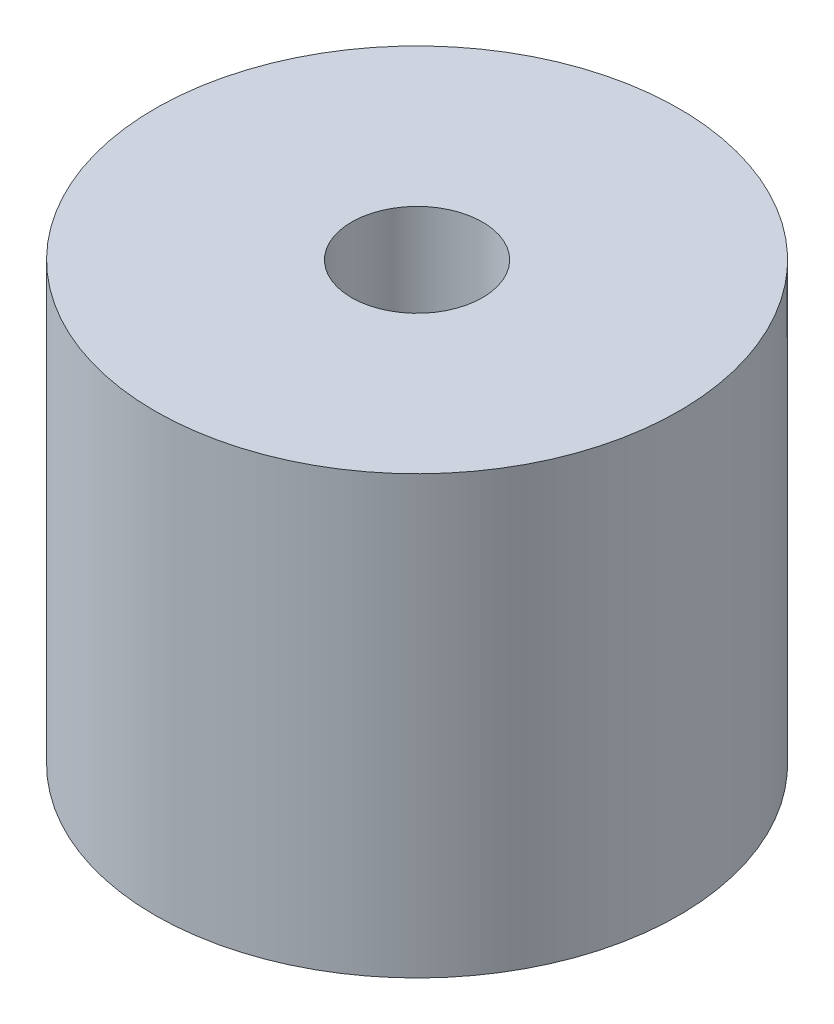
ISO-10303-21;
HEADER;
FILE_DESCRIPTION(('STEP AP214'),'2;1');
FILE_NAME('part.step','',(''),(''),'','','');
FILE_SCHEMA(('AUTOMOTIVE_DESIGN { 1 0 10303 214 1 1 1 1 }'));
ENDSEC;
DATA;
#1=APPLICATION_CONTEXT('core data for automotive mechanical design processes');
#2=APPLICATION_PROTOCOL_DEFINITION('international standard','automotive_design',2000,#1);
#3=PRODUCT_CONTEXT('',#1,'mechanical');
#4=PRODUCT('Part','Part','',(#3));
#5=PRODUCT_RELATED_PRODUCT_CATEGORY('part','',(#4));
#6=PRODUCT_DEFINITION_FORMATION('','',#4);
#7=PRODUCT_DEFINITION_CONTEXT('part definition',#1,'design');
#8=PRODUCT_DEFINITION('design','',#6,#7);
#9=PRODUCT_DEFINITION_SHAPE('','',#8);
#10=(LENGTH_UNIT() NAMED_UNIT(*) SI_UNIT(.MILLI.,.METRE.));
#11=(NAMED_UNIT(*) PLANE_ANGLE_UNIT() SI_UNIT($,.RADIAN.));
#12=(NAMED_UNIT(*) SI_UNIT($,.STERADIAN.) SOLID_ANGLE_UNIT());
#13=UNCERTAINTY_MEASURE_WITH_UNIT(LENGTH_MEASURE(1.E-05),#10,'distance_accuracy_value','');
#14=(GEOMETRIC_REPRESENTATION_CONTEXT(3) GLOBAL_UNCERTAINTY_ASSIGNED_CONTEXT((#13)) GLOBAL_UNIT_ASSIGNED_CONTEXT((#10,
#11,#12)) REPRESENTATION_CONTEXT('',''));
#15=CARTESIAN_POINT('',(0.,0.,0.));
#16=DIRECTION('',(0.,0.,1.));
#17=DIRECTION('',(1.,0.,0.));
#18=AXIS2_PLACEMENT_3D('',#15,#16,#17);
#19=CARTESIAN_POINT('',(0.,0.,0.));
#20=DIRECTION('',(0.,1.,0.));
#21=DIRECTION('',(0.,0.,1.));
#22=AXIS2_PLACEMENT_3D('',#19,#20,#21);
#23=PLANE('',#22);
#24=DIRECTION('',(0.,0.,-1.));
#25=VECTOR('',#24,1.);
#26=CARTESIAN_POINT('',(3.05,0.,2.73998175176405));
#27=LINE('',#26,#25);
#28=CARTESIAN_POINT('',(3.05,0.,2.73998175176405));
#29=VERTEX_POINT('',#28);
#30=CARTESIAN_POINT('',(3.05,0.,-2.73998175176405));
#31=VERTEX_POINT('',#30);
#32=EDGE_CURVE('E77',#29,#31,#27,.T.);
#33=ORIENTED_EDGE('',*,*,#32,.T.);
#34=CARTESIAN_POINT('',(0.,0.,0.));
#35=DIRECTION('',(0.,-1.,0.));
#36=DIRECTION('',(0.,0.,-1.));
#37=AXIS2_PLACEMENT_3D('',#34,#35,#36);
#38=CIRCLE('',#37,4.1);
#39=EDGE_CURVE('E58',#29,#31,#38,.T.);
#40=ORIENTED_EDGE('',*,*,#39,.F.);
#41=EDGE_LOOP('',(#33,#40));
#42=FACE_BOUND('',#41,.T.);
#43=CARTESIAN_POINT('',(0.,0.,0.));
#44=DIRECTION('',(0.,1.,0.));
#45=DIRECTION('',(0.,0.,1.));
#46=AXIS2_PLACEMENT_3D('',#43,#44,#45);
#47=CIRCLE('',#46,12.);
#48=CARTESIAN_POINT('',(0.,0.,12.));
#49=VERTEX_POINT('',#48);
#50=EDGE_CURVE('E50',#49,#49,#47,.T.);
#51=ORIENTED_EDGE('',*,*,#50,.F.);
#52=EDGE_LOOP('',(#51));
#53=FACE_BOUND('',#52,.T.);
#54=ADVANCED_FACE('F41',(#42,#53),#23,.F.);
#55=CARTESIAN_POINT('',(0.,20.,0.));
#56=DIRECTION('',(0.,-1.,0.));
#57=DIRECTION('',(0.,0.,-1.));
#58=AXIS2_PLACEMENT_3D('',#55,#56,#57);
#59=CYLINDRICAL_SURFACE('',#58,12.);
#60=CARTESIAN_POINT('',(0.,20.,0.));
#61=DIRECTION('',(0.,1.,0.));
#62=DIRECTION('',(0.,0.,1.));
#63=AXIS2_PLACEMENT_3D('',#60,#61,#62);
#64=CIRCLE('',#63,12.);
#65=CARTESIAN_POINT('',(0.,20.,12.));
#66=VERTEX_POINT('',#65);
#67=EDGE_CURVE('E12',#66,#66,#64,.T.);
#68=ORIENTED_EDGE('',*,*,#67,.F.);
#69=EDGE_LOOP('',(#68));
#70=FACE_BOUND('',#69,.T.);
#71=ORIENTED_EDGE('',*,*,#50,.T.);
#72=EDGE_LOOP('',(#71));
#73=FACE_BOUND('',#72,.T.);
#74=ADVANCED_FACE('F43',(#70,#73),#59,.T.);
#75=CARTESIAN_POINT('',(0.,20.,0.));
#76=DIRECTION('',(0.,1.,0.));
#77=DIRECTION('',(0.,0.,1.));
#78=AXIS2_PLACEMENT_3D('',#75,#76,#77);
#79=PLANE('',#78);
#80=CARTESIAN_POINT('',(0.,20.,0.));
#81=DIRECTION('',(0.,1.,0.));
#82=DIRECTION('',(0.,0.,1.));
#83=AXIS2_PLACEMENT_3D('',#80,#81,#82);
#84=CIRCLE('',#83,3.);
#85=CARTESIAN_POINT('',(0.,20.,3.));
#86=VERTEX_POINT('',#85);
#87=EDGE_CURVE('E84',#86,#86,#84,.T.);
#88=ORIENTED_EDGE('',*,*,#87,.F.);
#89=EDGE_LOOP('',(#88));
#90=FACE_BOUND('',#89,.T.);
#91=ORIENTED_EDGE('',*,*,#67,.T.);
#92=EDGE_LOOP('',(#91));
#93=FACE_BOUND('',#92,.T.);
#94=ADVANCED_FACE('F93',(#90,#93),#79,.T.);
#95=CARTESIAN_POINT('',(0.,13.,0.));
#96=DIRECTION('',(0.,-1.,0.));
#97=DIRECTION('',(0.,0.,-1.));
#98=AXIS2_PLACEMENT_3D('',#95,#96,#97);
#99=CYLINDRICAL_SURFACE('',#98,4.1);
#100=ORIENTED_EDGE('',*,*,#39,.T.);
#101=DIRECTION('',(0.,-1.,0.));
#102=VECTOR('',#101,1.);
#103=CARTESIAN_POINT('',(3.05,13.,-2.73998175176405));
#104=LINE('',#103,#102);
#105=CARTESIAN_POINT('',(3.05,13.,-2.73998175176405));
#106=VERTEX_POINT('',#105);
#107=EDGE_CURVE('E74',#106,#31,#104,.T.);
#108=ORIENTED_EDGE('',*,*,#107,.F.);
#109=CARTESIAN_POINT('',(0.,13.,0.));
#110=DIRECTION('',(0.,-1.,0.));
#111=DIRECTION('',(0.,0.,-1.));
#112=AXIS2_PLACEMENT_3D('',#109,#110,#111);
#113=CIRCLE('',#112,4.1);
#114=CARTESIAN_POINT('',(3.05,13.,2.73998175176405));
#115=VERTEX_POINT('',#114);
#116=EDGE_CURVE('E73',#115,#106,#113,.T.);
#117=ORIENTED_EDGE('',*,*,#116,.F.);
#118=DIRECTION('',(0.,-1.,0.));
#119=VECTOR('',#118,1.);
#120=CARTESIAN_POINT('',(3.05,13.,2.73998175176405));
#121=LINE('',#120,#119);
#122=EDGE_CURVE('E66',#115,#29,#121,.T.);
#123=ORIENTED_EDGE('',*,*,#122,.T.);
#124=EDGE_LOOP('',(#100,#108,#117,#123));
#125=FACE_BOUND('',#124,.T.);
#126=ADVANCED_FACE('F71',(#125),#99,.F.);
#127=CARTESIAN_POINT('',(3.05,13.,2.73998175176405));
#128=DIRECTION('',(-1.,0.,0.));
#129=DIRECTION('',(0.,0.,1.));
#130=AXIS2_PLACEMENT_3D('',#127,#128,#129);
#131=PLANE('',#130);
#132=ORIENTED_EDGE('',*,*,#32,.F.);
#133=ORIENTED_EDGE('',*,*,#122,.F.);
#134=DIRECTION('',(0.,0.,-1.));
#135=VECTOR('',#134,1.);
#136=CARTESIAN_POINT('',(3.05,13.,2.73998175176405));
#137=LINE('',#136,#135);
#138=EDGE_CURVE('E86',#115,#106,#137,.T.);
#139=ORIENTED_EDGE('',*,*,#138,.T.);
#140=ORIENTED_EDGE('',*,*,#107,.T.);
#141=EDGE_LOOP('',(#132,#133,#139,#140));
#142=FACE_BOUND('',#141,.T.);
#143=ADVANCED_FACE('F78',(#142),#131,.T.);
#144=CARTESIAN_POINT('',(0.,13.,0.));
#145=DIRECTION('',(0.,-1.,0.));
#146=DIRECTION('',(0.,0.,-1.));
#147=AXIS2_PLACEMENT_3D('',#144,#145,#146);
#148=PLANE('',#147);
#149=CARTESIAN_POINT('',(0.,13.,0.));
#150=DIRECTION('',(0.,-1.,0.));
#151=DIRECTION('',(0.,0.,-1.));
#152=AXIS2_PLACEMENT_3D('',#149,#150,#151);
#153=CIRCLE('',#152,3.);
#154=CARTESIAN_POINT('',(0.,13.,3.));
#155=VERTEX_POINT('',#154);
#156=EDGE_CURVE('E45',#155,#155,#153,.T.);
#157=ORIENTED_EDGE('',*,*,#156,.F.);
#158=EDGE_LOOP('',(#157));
#159=FACE_BOUND('',#158,.T.);
#160=ORIENTED_EDGE('',*,*,#116,.T.);
#161=ORIENTED_EDGE('',*,*,#138,.F.);
#162=EDGE_LOOP('',(#160,#161));
#163=FACE_BOUND('',#162,.T.);
#164=ADVANCED_FACE('F110',(#159,#163),#148,.T.);
#165=CARTESIAN_POINT('',(0.,7.,0.));
#166=DIRECTION('',(0.,1.,0.));
#167=DIRECTION('',(0.,0.,1.));
#168=AXIS2_PLACEMENT_3D('',#165,#166,#167);
#169=CYLINDRICAL_SURFACE('',#168,3.);
#170=CARTESIAN_POINT('',(0.,13.,3.));
#171=CARTESIAN_POINT('',(0.,13.0729166666667,3.));
#172=CARTESIAN_POINT('',(0.,13.1458333333333,3.));
#173=CARTESIAN_POINT('',(0.,13.2916666666667,3.));
#174=CARTESIAN_POINT('',(0.,13.3645833333333,3.));
#175=CARTESIAN_POINT('',(0.,13.5104166666667,3.));
#176=CARTESIAN_POINT('',(0.,13.5833333333333,3.));
#177=CARTESIAN_POINT('',(0.,13.7291666666667,3.));
#178=CARTESIAN_POINT('',(0.,13.8020833333333,3.));
#179=CARTESIAN_POINT('',(0.,13.9479166666667,3.));
#180=CARTESIAN_POINT('',(0.,14.0208333333333,3.));
#181=CARTESIAN_POINT('',(0.,14.1666666666667,3.));
#182=CARTESIAN_POINT('',(0.,14.2395833333333,3.));
#183=CARTESIAN_POINT('',(0.,14.3854166666667,3.));
#184=CARTESIAN_POINT('',(0.,14.4583333333333,3.));
#185=CARTESIAN_POINT('',(0.,14.6041666666667,3.));
#186=CARTESIAN_POINT('',(0.,14.6770833333333,3.));
#187=CARTESIAN_POINT('',(0.,14.8229166666667,3.));
#188=CARTESIAN_POINT('',(0.,14.8958333333333,3.));
#189=CARTESIAN_POINT('',(0.,15.0416666666667,3.));
#190=CARTESIAN_POINT('',(0.,15.1145833333333,3.));
#191=CARTESIAN_POINT('',(0.,15.2604166666667,3.));
#192=CARTESIAN_POINT('',(0.,15.3333333333333,3.));
#193=CARTESIAN_POINT('',(0.,15.4791666666667,3.));
#194=CARTESIAN_POINT('',(0.,15.5520833333333,3.));
#195=CARTESIAN_POINT('',(0.,15.6979166666667,3.));
#196=CARTESIAN_POINT('',(0.,15.7708333333333,3.));
#197=CARTESIAN_POINT('',(0.,15.9166666666667,3.));
#198=CARTESIAN_POINT('',(0.,15.9895833333333,3.));
#199=CARTESIAN_POINT('',(0.,16.1354166666667,3.));
#200=CARTESIAN_POINT('',(0.,16.2083333333333,3.));
#201=CARTESIAN_POINT('',(0.,16.3541666666667,3.));
#202=CARTESIAN_POINT('',(0.,16.4270833333333,3.));
#203=CARTESIAN_POINT('',(0.,16.5729166666667,3.));
#204=CARTESIAN_POINT('',(0.,16.6458333333333,3.));
#205=CARTESIAN_POINT('',(0.,16.7916666666667,3.));
#206=CARTESIAN_POINT('',(0.,16.8645833333333,3.));
#207=CARTESIAN_POINT('',(0.,17.0104166666667,3.));
#208=CARTESIAN_POINT('',(0.,17.0833333333333,3.));
#209=CARTESIAN_POINT('',(0.,17.2291666666667,3.));
#210=CARTESIAN_POINT('',(0.,17.3020833333333,3.));
#211=CARTESIAN_POINT('',(0.,17.4479166666667,3.));
#212=CARTESIAN_POINT('',(0.,17.5208333333333,3.));
#213=CARTESIAN_POINT('',(0.,17.6666666666667,3.));
#214=CARTESIAN_POINT('',(0.,17.7395833333333,3.));
#215=CARTESIAN_POINT('',(0.,17.8854166666667,3.));
#216=CARTESIAN_POINT('',(0.,17.9583333333333,3.));
#217=CARTESIAN_POINT('',(0.,18.1041666666667,3.));
#218=CARTESIAN_POINT('',(0.,18.1770833333333,3.));
#219=CARTESIAN_POINT('',(0.,18.3229166666667,3.));
#220=CARTESIAN_POINT('',(0.,18.3958333333333,3.));
#221=CARTESIAN_POINT('',(0.,18.5416666666667,3.));
#222=CARTESIAN_POINT('',(0.,18.6145833333333,3.));
#223=CARTESIAN_POINT('',(0.,18.7604166666667,3.));
#224=CARTESIAN_POINT('',(0.,18.8333333333333,3.));
#225=CARTESIAN_POINT('',(0.,18.9791666666667,3.));
#226=CARTESIAN_POINT('',(0.,19.0520833333333,3.));
#227=CARTESIAN_POINT('',(0.,19.1979166666667,3.));
#228=CARTESIAN_POINT('',(0.,19.2708333333333,3.));
#229=CARTESIAN_POINT('',(0.,19.4166666666667,3.));
#230=CARTESIAN_POINT('',(0.,19.4895833333333,3.));
#231=CARTESIAN_POINT('',(0.,19.6354166666667,3.));
#232=CARTESIAN_POINT('',(0.,19.7083333333333,3.));
#233=CARTESIAN_POINT('',(0.,19.8541666666667,3.));
#234=CARTESIAN_POINT('',(0.,19.9270833333333,3.));
#235=CARTESIAN_POINT('',(0.,20.,3.));
#236=B_SPLINE_CURVE_WITH_KNOTS('',3,(#170,#171,#172,#173,#174,#175,#176,#177,#178,#179,#180,
#181,#182,#183,#184,#185,#186,#187,#188,#189,#190,#191,#192,#193,#194,#195,#196,#197,#198,#199,
#200,#201,#202,#203,#204,#205,#206,#207,#208,#209,#210,#211,#212,#213,#214,#215,#216,#217,#218,
#219,#220,#221,#222,#223,#224,#225,#226,#227,#228,#229,#230,#231,#232,#233,#234,#235),
.UNSPECIFIED.,.F.,.F.,(4,2,2,2,2,2,2,2,2,2,2,2,2,2,2,2,2,2,2,2,2,2,2,2,2,2,2,2,2,2,2,2,4),(0.,
0.21875,0.4375,0.656250000000001,0.874999999999999,1.09375,1.3125,1.53125,1.75,1.96875,2.1875,
2.40625,2.625,2.84375,3.0625,3.28125,3.5,3.71875,3.9375,4.15625,4.375,4.59375,4.8125,5.03125,
5.25,5.46875,5.6875,5.90625,6.125,6.34375,6.5625,6.78125,7.),.UNSPECIFIED.);
#237=EDGE_CURVE('BSEAM113',#155,#86,#236,.T.);
#238=ORIENTED_EDGE('',*,*,#156,.T.);
#239=ORIENTED_EDGE('',*,*,#87,.T.);
#240=ORIENTED_EDGE('',*,*,#237,.T.);
#241=ORIENTED_EDGE('',*,*,#237,.F.);
#242=EDGE_LOOP('',(#238,#240,#239,#241));
#243=FACE_BOUND('',#242,.T.);
#244=ADVANCED_FACE('F113',(#243),#169,.F.);
#245=CLOSED_SHELL('',(#54,#74,#94,#126,#143,#164,#244));
#246=MANIFOLD_SOLID_BREP('B2',#245);
#247=ADVANCED_BREP_SHAPE_REPRESENTATION('',(#18,#246),#14);
#248=SHAPE_DEFINITION_REPRESENTATION(#9,#247);
ENDSEC;
END-ISO-10303-21;
